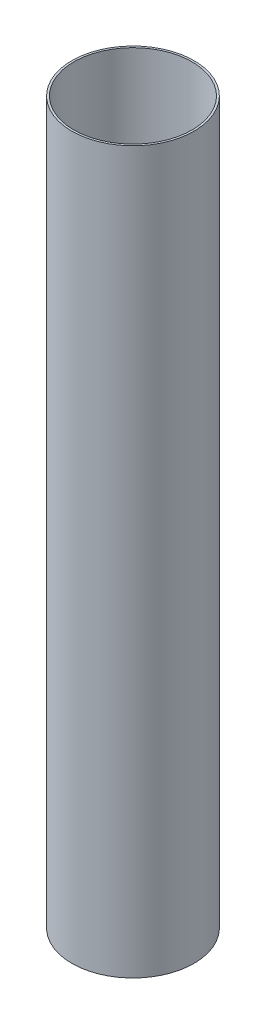
ISO-10303-21;
HEADER;
FILE_DESCRIPTION(('STEP AP214'),'2;1');
FILE_NAME('part.step','',(''),(''),'','','');
FILE_SCHEMA(('AUTOMOTIVE_DESIGN { 1 0 10303 214 1 1 1 1 }'));
ENDSEC;
DATA;
#1=APPLICATION_CONTEXT('core data for automotive mechanical design processes');
#2=APPLICATION_PROTOCOL_DEFINITION('international standard','automotive_design',2000,#1);
#3=PRODUCT_CONTEXT('',#1,'mechanical');
#4=PRODUCT('Part','Part','',(#3));
#5=PRODUCT_RELATED_PRODUCT_CATEGORY('part','',(#4));
#6=PRODUCT_DEFINITION_FORMATION('','',#4);
#7=PRODUCT_DEFINITION_CONTEXT('part definition',#1,'design');
#8=PRODUCT_DEFINITION('design','',#6,#7);
#9=PRODUCT_DEFINITION_SHAPE('','',#8);
#10=(LENGTH_UNIT() NAMED_UNIT(*) SI_UNIT(.MILLI.,.METRE.));
#11=(NAMED_UNIT(*) PLANE_ANGLE_UNIT() SI_UNIT($,.RADIAN.));
#12=(NAMED_UNIT(*) SI_UNIT($,.STERADIAN.) SOLID_ANGLE_UNIT());
#13=UNCERTAINTY_MEASURE_WITH_UNIT(LENGTH_MEASURE(1.E-05),#10,'distance_accuracy_value','');
#14=(GEOMETRIC_REPRESENTATION_CONTEXT(3) GLOBAL_UNCERTAINTY_ASSIGNED_CONTEXT((#13)) GLOBAL_UNIT_ASSIGNED_CONTEXT((#10,
#11,#12)) REPRESENTATION_CONTEXT('',''));
#15=CARTESIAN_POINT('',(0.,0.,0.));
#16=DIRECTION('',(0.,0.,1.));
#17=DIRECTION('',(1.,0.,0.));
#18=AXIS2_PLACEMENT_3D('',#15,#16,#17);
#19=CARTESIAN_POINT('',(0.,900.,0.));
#20=DIRECTION('',(0.,1.,0.));
#21=DIRECTION('',(0.,0.,1.));
#22=AXIS2_PLACEMENT_3D('',#19,#20,#21);
#23=PLANE('',#22);
#24=CARTESIAN_POINT('',(0.,900.,0.));
#25=DIRECTION('',(0.,1.,0.));
#26=DIRECTION('',(0.,0.,1.));
#27=AXIS2_PLACEMENT_3D('',#24,#25,#26);
#28=CIRCLE('',#27,76.3);
#29=CARTESIAN_POINT('',(0.,900.,76.3));
#30=VERTEX_POINT('',#29);
#31=EDGE_CURVE('E10',#30,#30,#28,.T.);
#32=ORIENTED_EDGE('',*,*,#31,.T.);
#33=EDGE_LOOP('',(#32));
#34=FACE_BOUND('',#33,.T.);
#35=CARTESIAN_POINT('',(0.,900.,0.));
#36=DIRECTION('',(0.,1.,0.));
#37=DIRECTION('',(0.,0.,1.));
#38=AXIS2_PLACEMENT_3D('',#35,#36,#37);
#39=CIRCLE('',#38,73.8);
#40=CARTESIAN_POINT('',(0.,900.,73.8));
#41=VERTEX_POINT('',#40);
#42=EDGE_CURVE('E48',#41,#41,#39,.T.);
#43=ORIENTED_EDGE('',*,*,#42,.F.);
#44=EDGE_LOOP('',(#43));
#45=FACE_BOUND('',#44,.T.);
#46=ADVANCED_FACE('F37',(#34,#45),#23,.T.);
#47=CARTESIAN_POINT('',(0.,0.,0.));
#48=DIRECTION('',(0.,1.,0.));
#49=DIRECTION('',(0.,0.,1.));
#50=AXIS2_PLACEMENT_3D('',#47,#48,#49);
#51=PLANE('',#50);
#52=CARTESIAN_POINT('',(0.,0.,0.));
#53=DIRECTION('',(0.,1.,0.));
#54=DIRECTION('',(0.,0.,1.));
#55=AXIS2_PLACEMENT_3D('',#52,#53,#54);
#56=CIRCLE('',#55,76.3);
#57=CARTESIAN_POINT('',(0.,0.,76.3));
#58=VERTEX_POINT('',#57);
#59=EDGE_CURVE('E41',#58,#58,#56,.T.);
#60=ORIENTED_EDGE('',*,*,#59,.F.);
#61=EDGE_LOOP('',(#60));
#62=FACE_BOUND('',#61,.T.);
#63=CARTESIAN_POINT('',(0.,0.,0.));
#64=DIRECTION('',(0.,1.,0.));
#65=DIRECTION('',(0.,0.,1.));
#66=AXIS2_PLACEMENT_3D('',#63,#64,#65);
#67=CIRCLE('',#66,73.8);
#68=CARTESIAN_POINT('',(0.,0.,73.8));
#69=VERTEX_POINT('',#68);
#70=EDGE_CURVE('E50',#69,#69,#67,.T.);
#71=ORIENTED_EDGE('',*,*,#70,.T.);
#72=EDGE_LOOP('',(#71));
#73=FACE_BOUND('',#72,.T.);
#74=ADVANCED_FACE('F60',(#62,#73),#51,.F.);
#75=CARTESIAN_POINT('',(0.,900.,0.));
#76=DIRECTION('',(0.,-1.,0.));
#77=DIRECTION('',(0.,0.,-1.));
#78=AXIS2_PLACEMENT_3D('',#75,#76,#77);
#79=CYLINDRICAL_SURFACE('',#78,76.3);
#80=ORIENTED_EDGE('',*,*,#31,.F.);
#81=EDGE_LOOP('',(#80));
#82=FACE_BOUND('',#81,.T.);
#83=ORIENTED_EDGE('',*,*,#59,.T.);
#84=EDGE_LOOP('',(#83));
#85=FACE_BOUND('',#84,.T.);
#86=ADVANCED_FACE('F39',(#82,#85),#79,.T.);
#87=CARTESIAN_POINT('',(0.,900.,0.));
#88=DIRECTION('',(0.,-1.,0.));
#89=DIRECTION('',(0.,0.,-1.));
#90=AXIS2_PLACEMENT_3D('',#87,#88,#89);
#91=CYLINDRICAL_SURFACE('',#90,73.8);
#92=ORIENTED_EDGE('',*,*,#42,.T.);
#93=EDGE_LOOP('',(#92));
#94=FACE_BOUND('',#93,.T.);
#95=ORIENTED_EDGE('',*,*,#70,.F.);
#96=EDGE_LOOP('',(#95));
#97=FACE_BOUND('',#96,.T.);
#98=ADVANCED_FACE('F56',(#94,#97),#91,.F.);
#99=CLOSED_SHELL('',(#46,#74,#86,#98));
#100=MANIFOLD_SOLID_BREP('B2',#99);
#101=ADVANCED_BREP_SHAPE_REPRESENTATION('',(#18,#100),#14);
#102=SHAPE_DEFINITION_REPRESENTATION(#9,#101);
ENDSEC;
END-ISO-10303-21;
